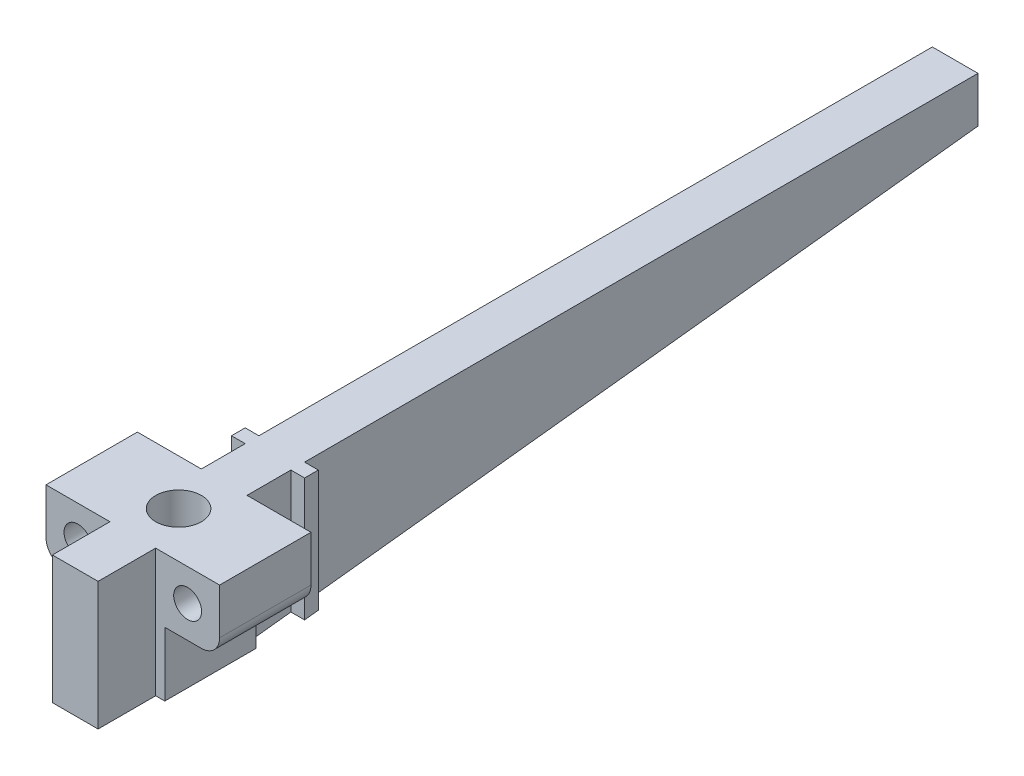
ISO-10303-21;
HEADER;
FILE_DESCRIPTION(('STEP AP214'),'2;1');
FILE_NAME('part.step','',(''),(''),'','','');
FILE_SCHEMA(('AUTOMOTIVE_DESIGN { 1 0 10303 214 1 1 1 1 }'));
ENDSEC;
DATA;
#1=APPLICATION_CONTEXT('core data for automotive mechanical design processes');
#2=APPLICATION_PROTOCOL_DEFINITION('international standard','automotive_design',2000,#1);
#3=PRODUCT_CONTEXT('',#1,'mechanical');
#4=PRODUCT('Part','Part','',(#3));
#5=PRODUCT_RELATED_PRODUCT_CATEGORY('part','',(#4));
#6=PRODUCT_DEFINITION_FORMATION('','',#4);
#7=PRODUCT_DEFINITION_CONTEXT('part definition',#1,'design');
#8=PRODUCT_DEFINITION('design','',#6,#7);
#9=PRODUCT_DEFINITION_SHAPE('','',#8);
#10=(LENGTH_UNIT() NAMED_UNIT(*) SI_UNIT(.MILLI.,.METRE.));
#11=(NAMED_UNIT(*) PLANE_ANGLE_UNIT() SI_UNIT($,.RADIAN.));
#12=(NAMED_UNIT(*) SI_UNIT($,.STERADIAN.) SOLID_ANGLE_UNIT());
#13=UNCERTAINTY_MEASURE_WITH_UNIT(LENGTH_MEASURE(1.E-05),#10,'distance_accuracy_value','');
#14=(GEOMETRIC_REPRESENTATION_CONTEXT(3) GLOBAL_UNCERTAINTY_ASSIGNED_CONTEXT((#13)) GLOBAL_UNIT_ASSIGNED_CONTEXT((#10,
#11,#12)) REPRESENTATION_CONTEXT('',''));
#15=CARTESIAN_POINT('',(0.,0.,0.));
#16=DIRECTION('',(0.,0.,1.));
#17=DIRECTION('',(1.,0.,0.));
#18=AXIS2_PLACEMENT_3D('',#15,#16,#17);
#19=CARTESIAN_POINT('',(2.39047337661692,0.,0.));
#20=DIRECTION('',(1.,0.,0.));
#21=DIRECTION('',(0.,0.,-1.));
#22=AXIS2_PLACEMENT_3D('',#19,#20,#21);
#23=PLANE('',#22);
#24=DIRECTION('',(0.,-1.,0.));
#25=VECTOR('',#24,1.);
#26=CARTESIAN_POINT('',(2.39047337661692,0.,-6.3));
#27=LINE('',#26,#25);
#28=CARTESIAN_POINT('',(2.39047337661692,6.30136094619758,-6.3));
#29=VERTEX_POINT('',#28);
#30=CARTESIAN_POINT('',(2.39047337661692,-6.98988905380242,-6.3));
#31=VERTEX_POINT('',#30);
#32=EDGE_CURVE('E225',#29,#31,#27,.T.);
#33=ORIENTED_EDGE('',*,*,#32,.F.);
#34=DIRECTION('',(0.,0.,1.));
#35=VECTOR('',#34,1.);
#36=CARTESIAN_POINT('',(2.39047337661692,6.30136094619758,0.));
#37=LINE('',#36,#35);
#38=CARTESIAN_POINT('',(2.39047337661692,6.30136094619758,-80.));
#39=VERTEX_POINT('',#38);
#40=EDGE_CURVE('E325',#39,#29,#37,.T.);
#41=ORIENTED_EDGE('',*,*,#40,.F.);
#42=DIRECTION('',(0.,1.,0.));
#43=VECTOR('',#42,1.);
#44=CARTESIAN_POINT('',(2.39047337661692,6.30136094619758,-80.));
#45=LINE('',#44,#43);
#46=CARTESIAN_POINT('',(2.39047337661692,1.30136094619758,-80.));
#47=VERTEX_POINT('',#46);
#48=EDGE_CURVE('E321',#47,#39,#45,.T.);
#49=ORIENTED_EDGE('',*,*,#48,.F.);
#50=DIRECTION('',(0.,0.111794773067865,-0.993731316158802));
#51=VECTOR('',#50,1.);
#52=CARTESIAN_POINT('',(2.39047337661692,1.30136094619758,-80.));
#53=LINE('',#52,#51);
#54=EDGE_CURVE('E318',#31,#47,#53,.T.);
#55=ORIENTED_EDGE('',*,*,#54,.F.);
#56=EDGE_LOOP('',(#33,#41,#49,#55));
#57=FACE_BOUND('',#56,.T.);
#58=ADVANCED_FACE('F36',(#57),#23,.F.);
#59=CARTESIAN_POINT('',(7.39047337661692,0.,0.));
#60=DIRECTION('',(1.,0.,0.));
#61=DIRECTION('',(0.,0.,-1.));
#62=AXIS2_PLACEMENT_3D('',#59,#60,#61);
#63=PLANE('',#62);
#64=DIRECTION('',(0.,0.111794773067865,-0.993731316158802));
#65=VECTOR('',#64,1.);
#66=CARTESIAN_POINT('',(7.39047337661692,1.30136094619758,-80.));
#67=LINE('',#66,#65);
#68=CARTESIAN_POINT('',(7.39047337661692,-7.69863905380242,0.));
#69=VERTEX_POINT('',#68);
#70=CARTESIAN_POINT('',(7.39047337661692,-7.15863905380242,-4.80000000000001));
#71=VERTEX_POINT('',#70);
#72=EDGE_CURVE('E307',#69,#71,#67,.T.);
#73=ORIENTED_EDGE('',*,*,#72,.T.);
#74=DIRECTION('',(0.,-1.,0.));
#75=VECTOR('',#74,1.);
#76=CARTESIAN_POINT('',(7.39047337661692,0.,-4.8));
#77=LINE('',#76,#75);
#78=CARTESIAN_POINT('',(7.39047337661692,6.30136094619758,-4.8));
#79=VERTEX_POINT('',#78);
#80=EDGE_CURVE('E59',#79,#71,#77,.T.);
#81=ORIENTED_EDGE('',*,*,#80,.F.);
#82=DIRECTION('',(0.,0.,1.));
#83=VECTOR('',#82,1.);
#84=CARTESIAN_POINT('',(7.39047337661692,6.30136094619758,0.));
#85=LINE('',#84,#83);
#86=CARTESIAN_POINT('',(7.39047337661692,6.30136094619758,0.));
#87=VERTEX_POINT('',#86);
#88=EDGE_CURVE('E312',#79,#87,#85,.T.);
#89=ORIENTED_EDGE('',*,*,#88,.T.);
#90=DIRECTION('',(0.,-1.,0.));
#91=VECTOR('',#90,1.);
#92=CARTESIAN_POINT('',(7.39047337661692,6.30136094619758,0.));
#93=LINE('',#92,#91);
#94=EDGE_CURVE('E303',#87,#69,#93,.T.);
#95=ORIENTED_EDGE('',*,*,#94,.T.);
#96=EDGE_LOOP('',(#73,#81,#89,#95));
#97=FACE_BOUND('',#96,.T.);
#98=ADVANCED_FACE('F499',(#97),#63,.T.);
#99=CARTESIAN_POINT('',(-2.60952662338309,1.30136094619758,10.));
#100=DIRECTION('',(0.,0.,1.));
#101=DIRECTION('',(1.,0.,0.));
#102=AXIS2_PLACEMENT_3D('',#99,#100,#101);
#103=PLANE('',#102);
#104=DIRECTION('',(0.,-1.,0.));
#105=VECTOR('',#104,1.);
#106=CARTESIAN_POINT('',(2.39047337661692,6.30136094619758,10.));
#107=LINE('',#106,#105);
#108=CARTESIAN_POINT('',(2.39047337661692,6.30136094619758,10.));
#109=VERTEX_POINT('',#108);
#110=CARTESIAN_POINT('',(2.39047337661692,-7.69863905380242,10.));
#111=VERTEX_POINT('',#110);
#112=EDGE_CURVE('E276',#109,#111,#107,.T.);
#113=ORIENTED_EDGE('',*,*,#112,.F.);
#114=DIRECTION('',(-1.,0.,0.));
#115=VECTOR('',#114,1.);
#116=CARTESIAN_POINT('',(14.3904733766169,6.30136094619758,10.));
#117=LINE('',#116,#115);
#118=CARTESIAN_POINT('',(-4.60952662338308,6.30136094619758,10.));
#119=VERTEX_POINT('',#118);
#120=EDGE_CURVE('E351',#109,#119,#117,.T.);
#121=ORIENTED_EDGE('',*,*,#120,.T.);
#122=DIRECTION('',(0.,-1.,0.));
#123=VECTOR('',#122,1.);
#124=CARTESIAN_POINT('',(-4.60952662338308,6.30136094619758,10.));
#125=LINE('',#124,#123);
#126=CARTESIAN_POINT('',(-4.60952662338308,1.30136094619758,10.));
#127=VERTEX_POINT('',#126);
#128=EDGE_CURVE('E350',#119,#127,#125,.T.);
#129=ORIENTED_EDGE('',*,*,#128,.T.);
#130=CARTESIAN_POINT('',(-2.60952662338309,1.30136094619758,10.));
#131=DIRECTION('',(0.,0.,1.));
#132=DIRECTION('',(1.,0.,0.));
#133=AXIS2_PLACEMENT_3D('',#130,#131,#132);
#134=CIRCLE('',#133,2.);
#135=CARTESIAN_POINT('',(-2.60952662338309,-0.698639053802419,10.));
#136=VERTEX_POINT('',#135);
#137=EDGE_CURVE('E353',#127,#136,#134,.T.);
#138=ORIENTED_EDGE('',*,*,#137,.T.);
#139=DIRECTION('',(1.,0.,0.));
#140=VECTOR('',#139,1.);
#141=CARTESIAN_POINT('',(-2.60952662338309,-0.698639053802422,10.));
#142=LINE('',#141,#140);
#143=CARTESIAN_POINT('',(1.39047337661689,-0.698639053802422,10.));
#144=VERTEX_POINT('',#143);
#145=EDGE_CURVE('E355',#136,#144,#142,.T.);
#146=ORIENTED_EDGE('',*,*,#145,.T.);
#147=DIRECTION('',(0.,-1.,0.));
#148=VECTOR('',#147,1.);
#149=CARTESIAN_POINT('',(1.39047337661689,-0.698639053802422,10.));
#150=LINE('',#149,#148);
#151=CARTESIAN_POINT('',(1.39047337661689,-7.69863905380242,10.));
#152=VERTEX_POINT('',#151);
#153=EDGE_CURVE('E357',#144,#152,#150,.T.);
#154=ORIENTED_EDGE('',*,*,#153,.T.);
#155=DIRECTION('',(1.,0.,0.));
#156=VECTOR('',#155,1.);
#157=CARTESIAN_POINT('',(1.39047337661689,-7.69863905380242,10.));
#158=LINE('',#157,#156);
#159=EDGE_CURVE('E360',#152,#111,#158,.T.);
#160=ORIENTED_EDGE('',*,*,#159,.T.);
#161=EDGE_LOOP('',(#113,#121,#129,#138,#146,#154,#160));
#162=FACE_BOUND('',#161,.T.);
#163=CARTESIAN_POINT('',(-1.10952662338309,2.80136094619758,10.));
#164=DIRECTION('',(0.,0.,1.));
#165=DIRECTION('',(1.,0.,0.));
#166=AXIS2_PLACEMENT_3D('',#163,#164,#165);
#167=CIRCLE('',#166,1.52500000000001);
#168=CARTESIAN_POINT('',(0.415473376616922,2.80136094619758,10.));
#169=VERTEX_POINT('',#168);
#170=EDGE_CURVE('E336',#169,#169,#167,.T.);
#171=ORIENTED_EDGE('',*,*,#170,.F.);
#172=EDGE_LOOP('',(#171));
#173=FACE_BOUND('',#172,.T.);
#174=ADVANCED_FACE('F443',(#162,#173),#103,.T.);
#175=CARTESIAN_POINT('',(-2.60952662338309,1.30136094619758,0.));
#176=DIRECTION('',(0.,0.,1.));
#177=DIRECTION('',(1.,0.,0.));
#178=AXIS2_PLACEMENT_3D('',#175,#176,#177);
#179=PLANE('',#178);
#180=CARTESIAN_POINT('',(10.8904733766169,2.80136094619758,0.));
#181=DIRECTION('',(0.,0.,1.));
#182=DIRECTION('',(1.,0.,0.));
#183=AXIS2_PLACEMENT_3D('',#180,#181,#182);
#184=CIRCLE('',#183,1.52500000000001);
#185=CARTESIAN_POINT('',(12.4154733766169,2.80136094619758,0.));
#186=VERTEX_POINT('',#185);
#187=EDGE_CURVE('E339',#186,#186,#184,.T.);
#188=ORIENTED_EDGE('',*,*,#187,.T.);
#189=EDGE_LOOP('',(#188));
#190=FACE_BOUND('',#189,.T.);
#191=ORIENTED_EDGE('',*,*,#94,.F.);
#192=DIRECTION('',(-1.,0.,0.));
#193=VECTOR('',#192,1.);
#194=CARTESIAN_POINT('',(14.3904733766169,6.30136094619758,0.));
#195=LINE('',#194,#193);
#196=CARTESIAN_POINT('',(14.3904733766169,6.30136094619758,0.));
#197=VERTEX_POINT('',#196);
#198=EDGE_CURVE('E371',#197,#87,#195,.T.);
#199=ORIENTED_EDGE('',*,*,#198,.F.);
#200=DIRECTION('',(0.,1.,0.));
#201=VECTOR('',#200,1.);
#202=CARTESIAN_POINT('',(14.3904733766169,1.30136094619758,0.));
#203=LINE('',#202,#201);
#204=CARTESIAN_POINT('',(14.3904733766169,1.30136094619758,0.));
#205=VERTEX_POINT('',#204);
#206=EDGE_CURVE('E392',#205,#197,#203,.T.);
#207=ORIENTED_EDGE('',*,*,#206,.F.);
#208=CARTESIAN_POINT('',(12.3904733766169,1.30136094619758,0.));
#209=DIRECTION('',(0.,0.,1.));
#210=DIRECTION('',(1.,0.,0.));
#211=AXIS2_PLACEMENT_3D('',#208,#209,#210);
#212=CIRCLE('',#211,2.);
#213=CARTESIAN_POINT('',(12.3904733766169,-0.698639053802422,0.));
#214=VERTEX_POINT('',#213);
#215=EDGE_CURVE('E390',#214,#205,#212,.T.);
#216=ORIENTED_EDGE('',*,*,#215,.F.);
#217=DIRECTION('',(1.,0.,0.));
#218=VECTOR('',#217,1.);
#219=CARTESIAN_POINT('',(8.39047337661691,-0.698639053802422,0.));
#220=LINE('',#219,#218);
#221=CARTESIAN_POINT('',(8.39047337661691,-0.698639053802422,0.));
#222=VERTEX_POINT('',#221);
#223=EDGE_CURVE('E388',#222,#214,#220,.T.);
#224=ORIENTED_EDGE('',*,*,#223,.F.);
#225=DIRECTION('',(0.,1.,0.));
#226=VECTOR('',#225,1.);
#227=CARTESIAN_POINT('',(8.39047337661691,-7.69863905380242,0.));
#228=LINE('',#227,#226);
#229=CARTESIAN_POINT('',(8.39047337661691,-7.69863905380242,0.));
#230=VERTEX_POINT('',#229);
#231=EDGE_CURVE('E386',#230,#222,#228,.T.);
#232=ORIENTED_EDGE('',*,*,#231,.F.);
#233=DIRECTION('',(1.,0.,0.));
#234=VECTOR('',#233,1.);
#235=CARTESIAN_POINT('',(1.39047337661689,-7.69863905380242,0.));
#236=LINE('',#235,#234);
#237=EDGE_CURVE('E382',#69,#230,#236,.T.);
#238=ORIENTED_EDGE('',*,*,#237,.F.);
#239=EDGE_LOOP('',(#191,#199,#207,#216,#224,#232,#238));
#240=FACE_BOUND('',#239,.T.);
#241=ADVANCED_FACE('F498',(#190,#240),#179,.F.);
#242=DIRECTION('',(0.,1.,0.));
#243=VECTOR('',#242,1.);
#244=CARTESIAN_POINT('',(7.39047337661692,6.30136094619758,10.));
#245=LINE('',#244,#243);
#246=CARTESIAN_POINT('',(7.39047337661692,-7.69863905380242,10.));
#247=VERTEX_POINT('',#246);
#248=CARTESIAN_POINT('',(7.39047337661692,6.30136094619758,10.));
#249=VERTEX_POINT('',#248);
#250=EDGE_CURVE('E281',#247,#249,#245,.T.);
#251=ORIENTED_EDGE('',*,*,#250,.F.);
#252=CARTESIAN_POINT('',(8.39047337661691,-7.69863905380242,10.));
#253=VERTEX_POINT('',#252);
#254=EDGE_CURVE('E359',#247,#253,#158,.T.);
#255=ORIENTED_EDGE('',*,*,#254,.T.);
#256=DIRECTION('',(0.,1.,0.));
#257=VECTOR('',#256,1.);
#258=CARTESIAN_POINT('',(8.39047337661691,-7.69863905380242,10.));
#259=LINE('',#258,#257);
#260=CARTESIAN_POINT('',(8.39047337661691,-0.698639053802422,10.));
#261=VERTEX_POINT('',#260);
#262=EDGE_CURVE('E362',#253,#261,#259,.T.);
#263=ORIENTED_EDGE('',*,*,#262,.T.);
#264=DIRECTION('',(1.,0.,0.));
#265=VECTOR('',#264,1.);
#266=CARTESIAN_POINT('',(8.39047337661691,-0.698639053802422,10.));
#267=LINE('',#266,#265);
#268=CARTESIAN_POINT('',(12.3904733766169,-0.698639053802422,10.));
#269=VERTEX_POINT('',#268);
#270=EDGE_CURVE('E364',#261,#269,#267,.T.);
#271=ORIENTED_EDGE('',*,*,#270,.T.);
#272=CARTESIAN_POINT('',(12.3904733766169,1.30136094619758,10.));
#273=DIRECTION('',(0.,0.,1.));
#274=DIRECTION('',(1.,0.,0.));
#275=AXIS2_PLACEMENT_3D('',#272,#273,#274);
#276=CIRCLE('',#275,2.);
#277=CARTESIAN_POINT('',(14.3904733766169,1.30136094619758,10.));
#278=VERTEX_POINT('',#277);
#279=EDGE_CURVE('E366',#269,#278,#276,.T.);
#280=ORIENTED_EDGE('',*,*,#279,.T.);
#281=DIRECTION('',(0.,1.,0.));
#282=VECTOR('',#281,1.);
#283=CARTESIAN_POINT('',(14.3904733766169,1.30136094619758,10.));
#284=LINE('',#283,#282);
#285=CARTESIAN_POINT('',(14.3904733766169,6.30136094619758,10.));
#286=VERTEX_POINT('',#285);
#287=EDGE_CURVE('E368',#278,#286,#284,.T.);
#288=ORIENTED_EDGE('',*,*,#287,.T.);
#289=EDGE_CURVE('E348',#286,#249,#117,.T.);
#290=ORIENTED_EDGE('',*,*,#289,.T.);
#291=EDGE_LOOP('',(#251,#255,#263,#271,#280,#288,#290));
#292=FACE_BOUND('',#291,.T.);
#293=CARTESIAN_POINT('',(10.8904733766169,2.80136094619758,10.));
#294=DIRECTION('',(0.,0.,1.));
#295=DIRECTION('',(1.,0.,0.));
#296=AXIS2_PLACEMENT_3D('',#293,#294,#295);
#297=CIRCLE('',#296,1.52500000000001);
#298=CARTESIAN_POINT('',(12.4154733766169,2.80136094619758,10.));
#299=VERTEX_POINT('',#298);
#300=EDGE_CURVE('E342',#299,#299,#297,.T.);
#301=ORIENTED_EDGE('',*,*,#300,.F.);
#302=EDGE_LOOP('',(#301));
#303=FACE_BOUND('',#302,.T.);
#304=ADVANCED_FACE('F471',(#292,#303),#103,.T.);
#305=CARTESIAN_POINT('',(2.39047337661692,6.30136094619758,0.));
#306=VERTEX_POINT('',#305);
#307=CARTESIAN_POINT('',(-4.60952662338308,6.30136094619758,0.));
#308=VERTEX_POINT('',#307);
#309=EDGE_CURVE('E345',#306,#308,#195,.T.);
#310=ORIENTED_EDGE('',*,*,#309,.F.);
#311=DIRECTION('',(0.,-1.,0.));
#312=VECTOR('',#311,1.);
#313=CARTESIAN_POINT('',(2.39047337661692,6.30136094619758,0.));
#314=LINE('',#313,#312);
#315=CARTESIAN_POINT('',(2.39047337661692,-7.69863905380242,0.));
#316=VERTEX_POINT('',#315);
#317=EDGE_CURVE('E315',#306,#316,#314,.T.);
#318=ORIENTED_EDGE('',*,*,#317,.T.);
#319=CARTESIAN_POINT('',(1.39047337661689,-7.69863905380242,0.));
#320=VERTEX_POINT('',#319);
#321=EDGE_CURVE('E383',#320,#316,#236,.T.);
#322=ORIENTED_EDGE('',*,*,#321,.F.);
#323=DIRECTION('',(0.,-1.,0.));
#324=VECTOR('',#323,1.);
#325=CARTESIAN_POINT('',(1.39047337661689,-0.698639053802422,0.));
#326=LINE('',#325,#324);
#327=CARTESIAN_POINT('',(1.39047337661689,-0.698639053802422,0.));
#328=VERTEX_POINT('',#327);
#329=EDGE_CURVE('E380',#328,#320,#326,.T.);
#330=ORIENTED_EDGE('',*,*,#329,.F.);
#331=DIRECTION('',(1.,0.,0.));
#332=VECTOR('',#331,1.);
#333=CARTESIAN_POINT('',(-2.60952662338309,-0.698639053802422,0.));
#334=LINE('',#333,#332);
#335=CARTESIAN_POINT('',(-2.60952662338309,-0.698639053802419,0.));
#336=VERTEX_POINT('',#335);
#337=EDGE_CURVE('E378',#336,#328,#334,.T.);
#338=ORIENTED_EDGE('',*,*,#337,.F.);
#339=CARTESIAN_POINT('',(-2.60952662338309,1.30136094619758,0.));
#340=DIRECTION('',(0.,0.,1.));
#341=DIRECTION('',(1.,0.,0.));
#342=AXIS2_PLACEMENT_3D('',#339,#340,#341);
#343=CIRCLE('',#342,2.);
#344=CARTESIAN_POINT('',(-4.60952662338308,1.30136094619758,0.));
#345=VERTEX_POINT('',#344);
#346=EDGE_CURVE('E376',#345,#336,#343,.T.);
#347=ORIENTED_EDGE('',*,*,#346,.F.);
#348=DIRECTION('',(0.,-1.,0.));
#349=VECTOR('',#348,1.);
#350=CARTESIAN_POINT('',(-4.60952662338308,6.30136094619758,0.));
#351=LINE('',#350,#349);
#352=EDGE_CURVE('E374',#308,#345,#351,.T.);
#353=ORIENTED_EDGE('',*,*,#352,.F.);
#354=EDGE_LOOP('',(#310,#318,#322,#330,#338,#347,#353));
#355=FACE_BOUND('',#354,.T.);
#356=CARTESIAN_POINT('',(-1.10952662338309,2.80136094619758,0.));
#357=DIRECTION('',(0.,0.,1.));
#358=DIRECTION('',(1.,0.,0.));
#359=AXIS2_PLACEMENT_3D('',#356,#357,#358);
#360=CIRCLE('',#359,1.52500000000001);
#361=CARTESIAN_POINT('',(0.415473376616922,2.80136094619758,0.));
#362=VERTEX_POINT('',#361);
#363=EDGE_CURVE('E331',#362,#362,#360,.T.);
#364=ORIENTED_EDGE('',*,*,#363,.T.);
#365=EDGE_LOOP('',(#364));
#366=FACE_BOUND('',#365,.T.);
#367=ADVANCED_FACE('F429',(#355,#366),#179,.F.);
#368=CARTESIAN_POINT('',(14.3904733766169,6.30136094619758,10.));
#369=DIRECTION('',(0.,-1.,0.));
#370=DIRECTION('',(0.,0.,-1.));
#371=AXIS2_PLACEMENT_3D('',#368,#369,#370);
#372=PLANE('',#371);
#373=CARTESIAN_POINT('',(4.90088276251299,6.30136094619758,5.));
#374=DIRECTION('',(0.,1.,0.));
#375=DIRECTION('',(0.,0.,1.));
#376=AXIS2_PLACEMENT_3D('',#373,#374,#375);
#377=CIRCLE('',#376,2.5);
#378=CARTESIAN_POINT('',(4.90088276251299,6.30136094619758,7.5));
#379=VERTEX_POINT('',#378);
#380=EDGE_CURVE('E270',#379,#379,#377,.T.);
#381=ORIENTED_EDGE('',*,*,#380,.F.);
#382=EDGE_LOOP('',(#381));
#383=FACE_BOUND('',#382,.T.);
#384=ORIENTED_EDGE('',*,*,#198,.T.);
#385=ORIENTED_EDGE('',*,*,#88,.F.);
#386=DIRECTION('',(-1.,0.,0.));
#387=VECTOR('',#386,1.);
#388=CARTESIAN_POINT('',(8.89047337661692,6.30136094619758,-4.8));
#389=LINE('',#388,#387);
#390=CARTESIAN_POINT('',(8.89047337661692,6.30136094619758,-4.8));
#391=VERTEX_POINT('',#390);
#392=EDGE_CURVE('E264',#391,#79,#389,.T.);
#393=ORIENTED_EDGE('',*,*,#392,.F.);
#394=DIRECTION('',(0.,0.,1.));
#395=VECTOR('',#394,1.);
#396=CARTESIAN_POINT('',(8.89047337661692,6.30136094619758,0.));
#397=LINE('',#396,#395);
#398=CARTESIAN_POINT('',(8.89047337661692,6.30136094619758,-6.3));
#399=VERTEX_POINT('',#398);
#400=EDGE_CURVE('E249',#399,#391,#397,.T.);
#401=ORIENTED_EDGE('',*,*,#400,.F.);
#402=DIRECTION('',(-1.,0.,0.));
#403=VECTOR('',#402,1.);
#404=CARTESIAN_POINT('',(8.89047337661692,6.30136094619758,-6.3));
#405=LINE('',#404,#403);
#406=CARTESIAN_POINT('',(7.39047337661692,6.30136094619758,-6.3));
#407=VERTEX_POINT('',#406);
#408=EDGE_CURVE('E267',#399,#407,#405,.T.);
#409=ORIENTED_EDGE('',*,*,#408,.T.);
#410=CARTESIAN_POINT('',(7.39047337661692,6.30136094619758,-80.));
#411=VERTEX_POINT('',#410);
#412=EDGE_CURVE('E313',#411,#407,#85,.T.);
#413=ORIENTED_EDGE('',*,*,#412,.F.);
#414=DIRECTION('',(1.,0.,0.));
#415=VECTOR('',#414,1.);
#416=CARTESIAN_POINT('',(2.39047337661692,6.30136094619758,-80.));
#417=LINE('',#416,#415);
#418=EDGE_CURVE('E329',#39,#411,#417,.T.);
#419=ORIENTED_EDGE('',*,*,#418,.F.);
#420=ORIENTED_EDGE('',*,*,#40,.T.);
#421=DIRECTION('',(1.,0.,0.));
#422=VECTOR('',#421,1.);
#423=CARTESIAN_POINT('',(0.890473376616917,6.30136094619758,-6.3));
#424=LINE('',#423,#422);
#425=CARTESIAN_POINT('',(0.890473376616917,6.30136094619758,-6.3));
#426=VERTEX_POINT('',#425);
#427=EDGE_CURVE('E239',#426,#29,#424,.T.);
#428=ORIENTED_EDGE('',*,*,#427,.F.);
#429=DIRECTION('',(0.,0.,1.));
#430=VECTOR('',#429,1.);
#431=CARTESIAN_POINT('',(0.890473376616917,6.30136094619758,0.));
#432=LINE('',#431,#430);
#433=CARTESIAN_POINT('',(0.890473376616917,6.30136094619758,-4.8));
#434=VERTEX_POINT('',#433);
#435=EDGE_CURVE('E218',#426,#434,#432,.T.);
#436=ORIENTED_EDGE('',*,*,#435,.T.);
#437=DIRECTION('',(1.,0.,0.));
#438=VECTOR('',#437,1.);
#439=CARTESIAN_POINT('',(0.890473376616917,6.30136094619758,-4.8));
#440=LINE('',#439,#438);
#441=CARTESIAN_POINT('',(2.39047337661692,6.30136094619758,-4.8));
#442=VERTEX_POINT('',#441);
#443=EDGE_CURVE('E243',#434,#442,#440,.T.);
#444=ORIENTED_EDGE('',*,*,#443,.T.);
#445=EDGE_CURVE('E324',#442,#306,#37,.T.);
#446=ORIENTED_EDGE('',*,*,#445,.T.);
#447=ORIENTED_EDGE('',*,*,#309,.T.);
#448=DIRECTION('',(0.,0.,-1.));
#449=VECTOR('',#448,1.);
#450=CARTESIAN_POINT('',(-4.60952662338308,6.30136094619758,10.));
#451=LINE('',#450,#449);
#452=EDGE_CURVE('E11',#119,#308,#451,.T.);
#453=ORIENTED_EDGE('',*,*,#452,.F.);
#454=ORIENTED_EDGE('',*,*,#120,.F.);
#455=DIRECTION('',(0.,0.,-1.));
#456=VECTOR('',#455,1.);
#457=CARTESIAN_POINT('',(2.39047337661692,6.30136094619758,16.3));
#458=LINE('',#457,#456);
#459=CARTESIAN_POINT('',(2.39047337661692,6.30136094619758,16.3));
#460=VERTEX_POINT('',#459);
#461=EDGE_CURVE('E287',#460,#109,#458,.T.);
#462=ORIENTED_EDGE('',*,*,#461,.F.);
#463=DIRECTION('',(-1.,0.,0.));
#464=VECTOR('',#463,1.);
#465=CARTESIAN_POINT('',(2.39047337661692,6.30136094619758,16.3));
#466=LINE('',#465,#464);
#467=CARTESIAN_POINT('',(7.39047337661692,6.30136094619758,16.3));
#468=VERTEX_POINT('',#467);
#469=EDGE_CURVE('E285',#468,#460,#466,.T.);
#470=ORIENTED_EDGE('',*,*,#469,.F.);
#471=DIRECTION('',(0.,0.,-1.));
#472=VECTOR('',#471,1.);
#473=CARTESIAN_POINT('',(7.39047337661692,6.30136094619758,16.3));
#474=LINE('',#473,#472);
#475=EDGE_CURVE('E294',#468,#249,#474,.T.);
#476=ORIENTED_EDGE('',*,*,#475,.T.);
#477=ORIENTED_EDGE('',*,*,#289,.F.);
#478=DIRECTION('',(0.,0.,-1.));
#479=VECTOR('',#478,1.);
#480=CARTESIAN_POINT('',(14.3904733766169,6.30136094619758,10.));
#481=LINE('',#480,#479);
#482=EDGE_CURVE('E370',#286,#197,#481,.T.);
#483=ORIENTED_EDGE('',*,*,#482,.T.);
#484=EDGE_LOOP('',(#384,#385,#393,#401,#409,#413,#419,#420,#428,#436,#444,#446,#447,#453,#454,
#462,#470,#476,#477,#483));
#485=FACE_BOUND('',#484,.T.);
#486=ADVANCED_FACE('F38',(#383,#485),#372,.F.);
#487=CARTESIAN_POINT('',(-4.60952662338308,6.30136094619758,10.));
#488=DIRECTION('',(1.,0.,0.));
#489=DIRECTION('',(0.,0.,-1.));
#490=AXIS2_PLACEMENT_3D('',#487,#488,#489);
#491=PLANE('',#490);
#492=ORIENTED_EDGE('',*,*,#352,.T.);
#493=DIRECTION('',(0.,0.,-1.));
#494=VECTOR('',#493,1.);
#495=CARTESIAN_POINT('',(-4.60952662338308,1.30136094619758,10.));
#496=LINE('',#495,#494);
#497=EDGE_CURVE('E44',#127,#345,#496,.T.);
#498=ORIENTED_EDGE('',*,*,#497,.F.);
#499=ORIENTED_EDGE('',*,*,#128,.F.);
#500=ORIENTED_EDGE('',*,*,#452,.T.);
#501=EDGE_LOOP('',(#492,#498,#499,#500));
#502=FACE_BOUND('',#501,.T.);
#503=ADVANCED_FACE('F447',(#502),#491,.F.);
#504=CARTESIAN_POINT('',(-2.60952662338309,1.30136094619758,10.));
#505=DIRECTION('',(0.,0.,-1.));
#506=DIRECTION('',(-1.,0.,0.));
#507=AXIS2_PLACEMENT_3D('',#504,#505,#506);
#508=CYLINDRICAL_SURFACE('',#507,2.);
#509=ORIENTED_EDGE('',*,*,#346,.T.);
#510=DIRECTION('',(0.,0.,-1.));
#511=VECTOR('',#510,1.);
#512=CARTESIAN_POINT('',(-2.60952662338309,-0.698639053802419,10.));
#513=LINE('',#512,#511);
#514=EDGE_CURVE('E414',#136,#336,#513,.T.);
#515=ORIENTED_EDGE('',*,*,#514,.F.);
#516=ORIENTED_EDGE('',*,*,#137,.F.);
#517=ORIENTED_EDGE('',*,*,#497,.T.);
#518=EDGE_LOOP('',(#509,#515,#516,#517));
#519=FACE_BOUND('',#518,.T.);
#520=ADVANCED_FACE('F421',(#519),#508,.T.);
#521=CARTESIAN_POINT('',(-2.60952662338309,-0.698639053802422,10.));
#522=DIRECTION('',(0.,1.,0.));
#523=DIRECTION('',(0.,0.,1.));
#524=AXIS2_PLACEMENT_3D('',#521,#522,#523);
#525=PLANE('',#524);
#526=ORIENTED_EDGE('',*,*,#337,.T.);
#527=DIRECTION('',(0.,0.,-1.));
#528=VECTOR('',#527,1.);
#529=CARTESIAN_POINT('',(1.39047337661689,-0.698639053802422,10.));
#530=LINE('',#529,#528);
#531=EDGE_CURVE('E411',#144,#328,#530,.T.);
#532=ORIENTED_EDGE('',*,*,#531,.F.);
#533=ORIENTED_EDGE('',*,*,#145,.F.);
#534=ORIENTED_EDGE('',*,*,#514,.T.);
#535=EDGE_LOOP('',(#526,#532,#533,#534));
#536=FACE_BOUND('',#535,.T.);
#537=ADVANCED_FACE('F435',(#536),#525,.F.);
#538=CARTESIAN_POINT('',(1.39047337661689,-0.698639053802422,10.));
#539=DIRECTION('',(1.,0.,0.));
#540=DIRECTION('',(0.,0.,-1.));
#541=AXIS2_PLACEMENT_3D('',#538,#539,#540);
#542=PLANE('',#541);
#543=ORIENTED_EDGE('',*,*,#329,.T.);
#544=DIRECTION('',(0.,0.,-1.));
#545=VECTOR('',#544,1.);
#546=CARTESIAN_POINT('',(1.39047337661689,-7.69863905380242,10.));
#547=LINE('',#546,#545);
#548=EDGE_CURVE('E408',#152,#320,#547,.T.);
#549=ORIENTED_EDGE('',*,*,#548,.F.);
#550=ORIENTED_EDGE('',*,*,#153,.F.);
#551=ORIENTED_EDGE('',*,*,#531,.T.);
#552=EDGE_LOOP('',(#543,#549,#550,#551));
#553=FACE_BOUND('',#552,.T.);
#554=ADVANCED_FACE('F439',(#553),#542,.F.);
#555=CARTESIAN_POINT('',(1.39047337661689,-7.69863905380242,10.));
#556=DIRECTION('',(0.,1.,0.));
#557=DIRECTION('',(0.,0.,1.));
#558=AXIS2_PLACEMENT_3D('',#555,#556,#557);
#559=PLANE('',#558);
#560=CARTESIAN_POINT('',(4.90088276251299,-7.69863905380242,5.));
#561=DIRECTION('',(0.,1.,0.));
#562=DIRECTION('',(0.,0.,1.));
#563=AXIS2_PLACEMENT_3D('',#560,#561,#562);
#564=CIRCLE('',#563,2.5);
#565=CARTESIAN_POINT('',(4.90088276251299,-7.69863905380242,7.5));
#566=VERTEX_POINT('',#565);
#567=EDGE_CURVE('E273',#566,#566,#564,.F.);
#568=ORIENTED_EDGE('',*,*,#567,.F.);
#569=EDGE_LOOP('',(#568));
#570=FACE_BOUND('',#569,.T.);
#571=ORIENTED_EDGE('',*,*,#321,.T.);
#572=DIRECTION('',(1.,0.,0.));
#573=VECTOR('',#572,1.);
#574=CARTESIAN_POINT('',(2.39047337661692,-7.69863905380242,0.));
#575=LINE('',#574,#573);
#576=EDGE_CURVE('E328',#316,#69,#575,.T.);
#577=ORIENTED_EDGE('',*,*,#576,.T.);
#578=ORIENTED_EDGE('',*,*,#237,.T.);
#579=DIRECTION('',(0.,0.,-1.));
#580=VECTOR('',#579,1.);
#581=CARTESIAN_POINT('',(8.39047337661691,-7.69863905380242,10.));
#582=LINE('',#581,#580);
#583=EDGE_CURVE('E405',#253,#230,#582,.T.);
#584=ORIENTED_EDGE('',*,*,#583,.F.);
#585=ORIENTED_EDGE('',*,*,#254,.F.);
#586=DIRECTION('',(0.,0.,-1.));
#587=VECTOR('',#586,1.);
#588=CARTESIAN_POINT('',(7.39047337661692,-7.69863905380242,16.3));
#589=LINE('',#588,#587);
#590=CARTESIAN_POINT('',(7.39047337661692,-7.69863905380242,16.3));
#591=VERTEX_POINT('',#590);
#592=EDGE_CURVE('E297',#591,#247,#589,.T.);
#593=ORIENTED_EDGE('',*,*,#592,.F.);
#594=DIRECTION('',(1.,0.,0.));
#595=VECTOR('',#594,1.);
#596=CARTESIAN_POINT('',(2.39047337661692,-7.69863905380242,16.3));
#597=LINE('',#596,#595);
#598=CARTESIAN_POINT('',(2.39047337661692,-7.69863905380242,16.3));
#599=VERTEX_POINT('',#598);
#600=EDGE_CURVE('E280',#599,#591,#597,.T.);
#601=ORIENTED_EDGE('',*,*,#600,.F.);
#602=DIRECTION('',(0.,0.,-1.));
#603=VECTOR('',#602,1.);
#604=CARTESIAN_POINT('',(2.39047337661692,-7.69863905380242,16.3));
#605=LINE('',#604,#603);
#606=EDGE_CURVE('E300',#599,#111,#605,.T.);
#607=ORIENTED_EDGE('',*,*,#606,.T.);
#608=ORIENTED_EDGE('',*,*,#159,.F.);
#609=ORIENTED_EDGE('',*,*,#548,.T.);
#610=EDGE_LOOP('',(#571,#577,#578,#584,#585,#593,#601,#607,#608,#609));
#611=FACE_BOUND('',#610,.T.);
#612=ADVANCED_FACE('F454',(#570,#611),#559,.F.);
#613=CARTESIAN_POINT('',(8.39047337661691,-7.69863905380242,10.));
#614=DIRECTION('',(-1.,0.,0.));
#615=DIRECTION('',(0.,0.,1.));
#616=AXIS2_PLACEMENT_3D('',#613,#614,#615);
#617=PLANE('',#616);
#618=ORIENTED_EDGE('',*,*,#231,.T.);
#619=DIRECTION('',(0.,0.,-1.));
#620=VECTOR('',#619,1.);
#621=CARTESIAN_POINT('',(8.39047337661691,-0.698639053802422,10.));
#622=LINE('',#621,#620);
#623=EDGE_CURVE('E402',#261,#222,#622,.T.);
#624=ORIENTED_EDGE('',*,*,#623,.F.);
#625=ORIENTED_EDGE('',*,*,#262,.F.);
#626=ORIENTED_EDGE('',*,*,#583,.T.);
#627=EDGE_LOOP('',(#618,#624,#625,#626));
#628=FACE_BOUND('',#627,.T.);
#629=ADVANCED_FACE('F479',(#628),#617,.F.);
#630=CARTESIAN_POINT('',(8.39047337661691,-0.698639053802422,10.));
#631=DIRECTION('',(0.,1.,0.));
#632=DIRECTION('',(0.,0.,1.));
#633=AXIS2_PLACEMENT_3D('',#630,#631,#632);
#634=PLANE('',#633);
#635=ORIENTED_EDGE('',*,*,#223,.T.);
#636=DIRECTION('',(0.,0.,-1.));
#637=VECTOR('',#636,1.);
#638=CARTESIAN_POINT('',(12.3904733766169,-0.698639053802422,10.));
#639=LINE('',#638,#637);
#640=EDGE_CURVE('E399',#269,#214,#639,.T.);
#641=ORIENTED_EDGE('',*,*,#640,.F.);
#642=ORIENTED_EDGE('',*,*,#270,.F.);
#643=ORIENTED_EDGE('',*,*,#623,.T.);
#644=EDGE_LOOP('',(#635,#641,#642,#643));
#645=FACE_BOUND('',#644,.T.);
#646=ADVANCED_FACE('F485',(#645),#634,.F.);
#647=CARTESIAN_POINT('',(12.3904733766169,1.30136094619758,10.));
#648=DIRECTION('',(0.,0.,-1.));
#649=DIRECTION('',(-1.,0.,0.));
#650=AXIS2_PLACEMENT_3D('',#647,#648,#649);
#651=CYLINDRICAL_SURFACE('',#650,2.);
#652=ORIENTED_EDGE('',*,*,#215,.T.);
#653=DIRECTION('',(0.,0.,-1.));
#654=VECTOR('',#653,1.);
#655=CARTESIAN_POINT('',(14.3904733766169,1.30136094619758,10.));
#656=LINE('',#655,#654);
#657=EDGE_CURVE('E396',#278,#205,#656,.T.);
#658=ORIENTED_EDGE('',*,*,#657,.F.);
#659=ORIENTED_EDGE('',*,*,#279,.F.);
#660=ORIENTED_EDGE('',*,*,#640,.T.);
#661=EDGE_LOOP('',(#652,#658,#659,#660));
#662=FACE_BOUND('',#661,.T.);
#663=ADVANCED_FACE('F489',(#662),#651,.T.);
#664=CARTESIAN_POINT('',(14.3904733766169,1.30136094619758,10.));
#665=DIRECTION('',(-1.,0.,0.));
#666=DIRECTION('',(0.,0.,1.));
#667=AXIS2_PLACEMENT_3D('',#664,#665,#666);
#668=PLANE('',#667);
#669=ORIENTED_EDGE('',*,*,#206,.T.);
#670=ORIENTED_EDGE('',*,*,#482,.F.);
#671=ORIENTED_EDGE('',*,*,#287,.F.);
#672=ORIENTED_EDGE('',*,*,#657,.T.);
#673=EDGE_LOOP('',(#669,#670,#671,#672));
#674=FACE_BOUND('',#673,.T.);
#675=ADVANCED_FACE('F494',(#674),#668,.F.);
#676=CARTESIAN_POINT('',(10.8904733766169,2.80136094619758,10.));
#677=DIRECTION('',(0.,0.,-1.));
#678=DIRECTION('',(-1.,0.,0.));
#679=AXIS2_PLACEMENT_3D('',#676,#677,#678);
#680=CYLINDRICAL_SURFACE('',#679,1.52500000000001);
#681=ORIENTED_EDGE('',*,*,#300,.T.);
#682=EDGE_LOOP('',(#681));
#683=FACE_BOUND('',#682,.T.);
#684=ORIENTED_EDGE('',*,*,#187,.F.);
#685=EDGE_LOOP('',(#684));
#686=FACE_BOUND('',#685,.T.);
#687=ADVANCED_FACE('F688',(#683,#686),#680,.F.);
#688=CARTESIAN_POINT('',(-1.10952662338309,2.80136094619758,10.));
#689=DIRECTION('',(0.,0.,-1.));
#690=DIRECTION('',(-1.,0.,0.));
#691=AXIS2_PLACEMENT_3D('',#688,#689,#690);
#692=CYLINDRICAL_SURFACE('',#691,1.52500000000001);
#693=ORIENTED_EDGE('',*,*,#170,.T.);
#694=EDGE_LOOP('',(#693));
#695=FACE_BOUND('',#694,.T.);
#696=ORIENTED_EDGE('',*,*,#363,.F.);
#697=EDGE_LOOP('',(#696));
#698=FACE_BOUND('',#697,.T.);
#699=ADVANCED_FACE('F681',(#695,#698),#692,.F.);
#700=CARTESIAN_POINT('',(2.39047337661692,6.30136094619758,-80.));
#701=DIRECTION('',(0.,0.,-1.));
#702=DIRECTION('',(-1.,0.,0.));
#703=AXIS2_PLACEMENT_3D('',#700,#701,#702);
#704=PLANE('',#703);
#705=ORIENTED_EDGE('',*,*,#418,.T.);
#706=DIRECTION('',(0.,1.,0.));
#707=VECTOR('',#706,1.);
#708=CARTESIAN_POINT('',(7.39047337661692,6.30136094619758,-80.));
#709=LINE('',#708,#707);
#710=CARTESIAN_POINT('',(7.39047337661692,1.30136094619758,-80.));
#711=VERTEX_POINT('',#710);
#712=EDGE_CURVE('E309',#711,#411,#709,.T.);
#713=ORIENTED_EDGE('',*,*,#712,.F.);
#714=DIRECTION('',(1.,0.,0.));
#715=VECTOR('',#714,1.);
#716=CARTESIAN_POINT('',(2.39047337661692,1.30136094619758,-80.));
#717=LINE('',#716,#715);
#718=EDGE_CURVE('E332',#47,#711,#717,.T.);
#719=ORIENTED_EDGE('',*,*,#718,.F.);
#720=ORIENTED_EDGE('',*,*,#48,.T.);
#721=EDGE_LOOP('',(#705,#713,#719,#720));
#722=FACE_BOUND('',#721,.T.);
#723=ADVANCED_FACE('F520',(#722),#704,.T.);
#724=CARTESIAN_POINT('',(2.39047337661692,1.30136094619758,-80.));
#725=DIRECTION('',(0.,-0.993731316158802,-0.111794773067865));
#726=DIRECTION('',(0.,0.111794773067865,-0.993731316158802));
#727=AXIS2_PLACEMENT_3D('',#724,#725,#726);
#728=PLANE('',#727);
#729=ORIENTED_EDGE('',*,*,#718,.T.);
#730=CARTESIAN_POINT('',(7.39047337661692,-6.98988905380242,-6.3));
#731=VERTEX_POINT('',#730);
#732=EDGE_CURVE('E306',#731,#711,#67,.T.);
#733=ORIENTED_EDGE('',*,*,#732,.F.);
#734=DIRECTION('',(-1.,0.,0.));
#735=VECTOR('',#734,1.);
#736=CARTESIAN_POINT('',(8.89047337661692,-6.98988905380242,-6.3));
#737=LINE('',#736,#735);
#738=CARTESIAN_POINT('',(8.89047337661692,-6.98988905380242,-6.3));
#739=VERTEX_POINT('',#738);
#740=EDGE_CURVE('E255',#739,#731,#737,.T.);
#741=ORIENTED_EDGE('',*,*,#740,.F.);
#742=DIRECTION('',(0.,0.111794773067865,-0.993731316158802));
#743=VECTOR('',#742,1.);
#744=CARTESIAN_POINT('',(8.89047337661692,-7.60242091410824,-0.855272352837176));
#745=LINE('',#744,#743);
#746=CARTESIAN_POINT('',(8.89047337661692,-7.15863905380242,-4.8));
#747=VERTEX_POINT('',#746);
#748=EDGE_CURVE('E253',#747,#739,#745,.T.);
#749=ORIENTED_EDGE('',*,*,#748,.F.);
#750=DIRECTION('',(-1.,0.,0.));
#751=VECTOR('',#750,1.);
#752=CARTESIAN_POINT('',(8.89047337661692,-7.15863905380242,-4.8));
#753=LINE('',#752,#751);
#754=EDGE_CURVE('E261',#747,#71,#753,.T.);
#755=ORIENTED_EDGE('',*,*,#754,.T.);
#756=ORIENTED_EDGE('',*,*,#72,.F.);
#757=ORIENTED_EDGE('',*,*,#576,.F.);
#758=CARTESIAN_POINT('',(2.39047337661692,-7.15863905380242,-4.8));
#759=VERTEX_POINT('',#758);
#760=EDGE_CURVE('E319',#316,#759,#53,.T.);
#761=ORIENTED_EDGE('',*,*,#760,.T.);
#762=DIRECTION('',(1.,0.,0.));
#763=VECTOR('',#762,1.);
#764=CARTESIAN_POINT('',(0.890473376616917,-7.15863905380242,-4.8));
#765=LINE('',#764,#763);
#766=CARTESIAN_POINT('',(0.890473376616917,-7.15863905380242,-4.8));
#767=VERTEX_POINT('',#766);
#768=EDGE_CURVE('E229',#767,#759,#765,.T.);
#769=ORIENTED_EDGE('',*,*,#768,.F.);
#770=DIRECTION('',(0.,0.111794773067865,-0.993731316158802));
#771=VECTOR('',#770,1.);
#772=CARTESIAN_POINT('',(0.890473376616917,-7.60242091410824,-0.855272352837176));
#773=LINE('',#772,#771);
#774=CARTESIAN_POINT('',(0.890473376616917,-6.98988905380242,-6.3));
#775=VERTEX_POINT('',#774);
#776=EDGE_CURVE('E215',#767,#775,#773,.T.);
#777=ORIENTED_EDGE('',*,*,#776,.T.);
#778=DIRECTION('',(1.,0.,0.));
#779=VECTOR('',#778,1.);
#780=CARTESIAN_POINT('',(0.890473376616917,-6.98988905380242,-6.3));
#781=LINE('',#780,#779);
#782=EDGE_CURVE('E222',#775,#31,#781,.T.);
#783=ORIENTED_EDGE('',*,*,#782,.T.);
#784=ORIENTED_EDGE('',*,*,#54,.T.);
#785=EDGE_LOOP('',(#729,#733,#741,#749,#755,#756,#757,#761,#769,#777,#783,#784));
#786=FACE_BOUND('',#785,.T.);
#787=ADVANCED_FACE('F232',(#786),#728,.T.);
#788=ORIENTED_EDGE('',*,*,#445,.F.);
#789=DIRECTION('',(0.,-1.,0.));
#790=VECTOR('',#789,1.);
#791=CARTESIAN_POINT('',(2.39047337661692,0.,-4.8));
#792=LINE('',#791,#790);
#793=EDGE_CURVE('E51',#442,#759,#792,.T.);
#794=ORIENTED_EDGE('',*,*,#793,.T.);
#795=ORIENTED_EDGE('',*,*,#760,.F.);
#796=ORIENTED_EDGE('',*,*,#317,.F.);
#797=EDGE_LOOP('',(#788,#794,#795,#796));
#798=FACE_BOUND('',#797,.T.);
#799=ADVANCED_FACE('F524',(#798),#23,.F.);
#800=DIRECTION('',(0.,-1.,0.));
#801=VECTOR('',#800,1.);
#802=CARTESIAN_POINT('',(7.39047337661692,0.,-6.3));
#803=LINE('',#802,#801);
#804=EDGE_CURVE('E228',#407,#731,#803,.T.);
#805=ORIENTED_EDGE('',*,*,#804,.T.);
#806=ORIENTED_EDGE('',*,*,#732,.T.);
#807=ORIENTED_EDGE('',*,*,#712,.T.);
#808=ORIENTED_EDGE('',*,*,#412,.T.);
#809=EDGE_LOOP('',(#805,#806,#807,#808));
#810=FACE_BOUND('',#809,.T.);
#811=ADVANCED_FACE('F516',(#810),#63,.T.);
#812=CARTESIAN_POINT('',(2.39047337661692,6.30136094619758,16.3));
#813=DIRECTION('',(1.,0.,0.));
#814=DIRECTION('',(0.,1.,0.));
#815=AXIS2_PLACEMENT_3D('',#812,#813,#814);
#816=PLANE('',#815);
#817=ORIENTED_EDGE('',*,*,#112,.T.);
#818=ORIENTED_EDGE('',*,*,#606,.F.);
#819=DIRECTION('',(0.,-1.,0.));
#820=VECTOR('',#819,1.);
#821=CARTESIAN_POINT('',(2.39047337661692,6.30136094619758,16.3));
#822=LINE('',#821,#820);
#823=EDGE_CURVE('E277',#460,#599,#822,.T.);
#824=ORIENTED_EDGE('',*,*,#823,.F.);
#825=ORIENTED_EDGE('',*,*,#461,.T.);
#826=EDGE_LOOP('',(#817,#818,#824,#825));
#827=FACE_BOUND('',#826,.T.);
#828=ADVANCED_FACE('F460',(#827),#816,.F.);
#829=CARTESIAN_POINT('',(7.39047337661692,6.30136094619758,16.3));
#830=DIRECTION('',(-1.,0.,0.));
#831=DIRECTION('',(0.,-1.,0.));
#832=AXIS2_PLACEMENT_3D('',#829,#830,#831);
#833=PLANE('',#832);
#834=ORIENTED_EDGE('',*,*,#250,.T.);
#835=ORIENTED_EDGE('',*,*,#475,.F.);
#836=DIRECTION('',(0.,1.,0.));
#837=VECTOR('',#836,1.);
#838=CARTESIAN_POINT('',(7.39047337661692,6.30136094619758,16.3));
#839=LINE('',#838,#837);
#840=EDGE_CURVE('E283',#591,#468,#839,.T.);
#841=ORIENTED_EDGE('',*,*,#840,.F.);
#842=ORIENTED_EDGE('',*,*,#592,.T.);
#843=EDGE_LOOP('',(#834,#835,#841,#842));
#844=FACE_BOUND('',#843,.T.);
#845=ADVANCED_FACE('F468',(#844),#833,.F.);
#846=CARTESIAN_POINT('',(0.,0.,16.3));
#847=DIRECTION('',(0.,0.,1.));
#848=DIRECTION('',(1.,0.,0.));
#849=AXIS2_PLACEMENT_3D('',#846,#847,#848);
#850=PLANE('',#849);
#851=ORIENTED_EDGE('',*,*,#823,.T.);
#852=ORIENTED_EDGE('',*,*,#600,.T.);
#853=ORIENTED_EDGE('',*,*,#840,.T.);
#854=ORIENTED_EDGE('',*,*,#469,.T.);
#855=EDGE_LOOP('',(#851,#852,#853,#854));
#856=FACE_BOUND('',#855,.T.);
#857=ADVANCED_FACE('F465',(#856),#850,.T.);
#858=CARTESIAN_POINT('',(4.90088276251299,-7.69963905380242,5.));
#859=DIRECTION('',(0.,1.,0.));
#860=DIRECTION('',(0.,0.,1.));
#861=AXIS2_PLACEMENT_3D('',#858,#859,#860);
#862=CYLINDRICAL_SURFACE('',#861,2.5);
#863=CARTESIAN_POINT('',(4.90088276251299,6.30136094619758,7.5));
#864=CARTESIAN_POINT('',(4.90088276251299,6.15552761286424,7.5));
#865=CARTESIAN_POINT('',(4.90088276251299,6.00969427953091,7.5));
#866=CARTESIAN_POINT('',(4.90088276251299,5.71802761286424,7.5));
#867=CARTESIAN_POINT('',(4.90088276251299,5.57219427953091,7.5));
#868=CARTESIAN_POINT('',(4.90088276251299,5.28052761286424,7.5));
#869=CARTESIAN_POINT('',(4.90088276251299,5.13469427953091,7.5));
#870=CARTESIAN_POINT('',(4.90088276251299,4.84302761286424,7.5));
#871=CARTESIAN_POINT('',(4.90088276251299,4.69719427953091,7.5));
#872=CARTESIAN_POINT('',(4.90088276251299,4.40552761286424,7.5));
#873=CARTESIAN_POINT('',(4.90088276251299,4.25969427953091,7.5));
#874=CARTESIAN_POINT('',(4.90088276251299,3.96802761286424,7.5));
#875=CARTESIAN_POINT('',(4.90088276251299,3.82219427953091,7.5));
#876=CARTESIAN_POINT('',(4.90088276251299,3.53052761286424,7.5));
#877=CARTESIAN_POINT('',(4.90088276251299,3.38469427953091,7.5));
#878=CARTESIAN_POINT('',(4.90088276251299,3.09302761286424,7.5));
#879=CARTESIAN_POINT('',(4.90088276251299,2.94719427953091,7.5));
#880=CARTESIAN_POINT('',(4.90088276251299,2.65552761286424,7.5));
#881=CARTESIAN_POINT('',(4.90088276251299,2.50969427953091,7.5));
#882=CARTESIAN_POINT('',(4.90088276251299,2.21802761286424,7.5));
#883=CARTESIAN_POINT('',(4.90088276251299,2.07219427953091,7.5));
#884=CARTESIAN_POINT('',(4.90088276251299,1.78052761286424,7.5));
#885=CARTESIAN_POINT('',(4.90088276251299,1.63469427953091,7.5));
#886=CARTESIAN_POINT('',(4.90088276251299,1.34302761286424,7.5));
#887=CARTESIAN_POINT('',(4.90088276251299,1.19719427953091,7.5));
#888=CARTESIAN_POINT('',(4.90088276251299,0.905527612864243,7.5));
#889=CARTESIAN_POINT('',(4.90088276251299,0.759694279530909,7.5));
#890=CARTESIAN_POINT('',(4.90088276251299,0.468027612864243,7.5));
#891=CARTESIAN_POINT('',(4.90088276251299,0.32219427953091,7.5));
#892=CARTESIAN_POINT('',(4.90088276251299,0.0305276128642441,7.5));
#893=CARTESIAN_POINT('',(4.90088276251299,-0.115305720469089,7.5));
#894=CARTESIAN_POINT('',(4.90088276251299,-0.406972387135756,7.5));
#895=CARTESIAN_POINT('',(4.90088276251299,-0.552805720469089,7.5));
#896=CARTESIAN_POINT('',(4.90088276251299,-0.844472387135756,7.5));
#897=CARTESIAN_POINT('',(4.90088276251299,-0.990305720469089,7.5));
#898=CARTESIAN_POINT('',(4.90088276251299,-1.28197238713576,7.5));
#899=CARTESIAN_POINT('',(4.90088276251299,-1.42780572046909,7.5));
#900=CARTESIAN_POINT('',(4.90088276251299,-1.71947238713576,7.5));
#901=CARTESIAN_POINT('',(4.90088276251299,-1.86530572046909,7.5));
#902=CARTESIAN_POINT('',(4.90088276251299,-2.15697238713576,7.5));
#903=CARTESIAN_POINT('',(4.90088276251299,-2.30280572046909,7.5));
#904=CARTESIAN_POINT('',(4.90088276251299,-2.59447238713576,7.5));
#905=CARTESIAN_POINT('',(4.90088276251299,-2.74030572046909,7.5));
#906=CARTESIAN_POINT('',(4.90088276251299,-3.03197238713576,7.5));
#907=CARTESIAN_POINT('',(4.90088276251299,-3.17780572046909,7.5));
#908=CARTESIAN_POINT('',(4.90088276251299,-3.46947238713575,7.5));
#909=CARTESIAN_POINT('',(4.90088276251299,-3.61530572046909,7.5));
#910=CARTESIAN_POINT('',(4.90088276251299,-3.90697238713575,7.5));
#911=CARTESIAN_POINT('',(4.90088276251299,-4.05280572046909,7.5));
#912=CARTESIAN_POINT('',(4.90088276251299,-4.34447238713576,7.5));
#913=CARTESIAN_POINT('',(4.90088276251299,-4.49030572046909,7.5));
#914=CARTESIAN_POINT('',(4.90088276251299,-4.78197238713576,7.5));
#915=CARTESIAN_POINT('',(4.90088276251299,-4.92780572046909,7.5));
#916=CARTESIAN_POINT('',(4.90088276251299,-5.21947238713576,7.5));
#917=CARTESIAN_POINT('',(4.90088276251299,-5.36530572046909,7.5));
#918=CARTESIAN_POINT('',(4.90088276251299,-5.65697238713575,7.5));
#919=CARTESIAN_POINT('',(4.90088276251299,-5.80280572046909,7.5));
#920=CARTESIAN_POINT('',(4.90088276251299,-6.09447238713576,7.5));
#921=CARTESIAN_POINT('',(4.90088276251299,-6.24030572046909,7.5));
#922=CARTESIAN_POINT('',(4.90088276251299,-6.53197238713575,7.5));
#923=CARTESIAN_POINT('',(4.90088276251299,-6.67780572046909,7.5));
#924=CARTESIAN_POINT('',(4.90088276251299,-6.96947238713575,7.5));
#925=CARTESIAN_POINT('',(4.90088276251299,-7.11530572046909,7.5));
#926=CARTESIAN_POINT('',(4.90088276251299,-7.40697238713575,7.5));
#927=CARTESIAN_POINT('',(4.90088276251299,-7.55280572046909,7.5));
#928=CARTESIAN_POINT('',(4.90088276251299,-7.69863905380242,7.5));
#929=B_SPLINE_CURVE_WITH_KNOTS('',3,(#863,#864,#865,#866,#867,#868,#869,#870,#871,#872,#873,
#874,#875,#876,#877,#878,#879,#880,#881,#882,#883,#884,#885,#886,#887,#888,#889,#890,#891,#892,
#893,#894,#895,#896,#897,#898,#899,#900,#901,#902,#903,#904,#905,#906,#907,#908,#909,#910,#911,
#912,#913,#914,#915,#916,#917,#918,#919,#920,#921,#922,#923,#924,#925,#926,#927,#928),
.UNSPECIFIED.,.F.,.F.,(4,2,2,2,2,2,2,2,2,2,2,2,2,2,2,2,2,2,2,2,2,2,2,2,2,2,2,2,2,2,2,2,4),(0.,
0.4375,0.875000000000001,1.3125,1.75,2.1875,2.625,3.0625,3.5,3.9375,4.375,4.8125,5.25,5.6875,
6.125,6.5625,7.,7.4375,7.875,8.3125,8.75,9.1875,9.625,10.0625,10.5,10.9375,11.375,11.8125,12.25,
12.6875,13.125,13.5625,14.),.UNSPECIFIED.);
#930=EDGE_CURVE('BSEAM549',#379,#566,#929,.T.);
#931=ORIENTED_EDGE('',*,*,#380,.T.);
#932=ORIENTED_EDGE('',*,*,#567,.T.);
#933=ORIENTED_EDGE('',*,*,#930,.T.);
#934=ORIENTED_EDGE('',*,*,#930,.F.);
#935=EDGE_LOOP('',(#931,#933,#932,#934));
#936=FACE_BOUND('',#935,.T.);
#937=ADVANCED_FACE('F549',(#936),#862,.F.);
#938=CARTESIAN_POINT('',(8.89047337661692,0.,-6.3));
#939=DIRECTION('',(0.,0.,-1.));
#940=DIRECTION('',(0.,1.,0.));
#941=AXIS2_PLACEMENT_3D('',#938,#939,#940);
#942=PLANE('',#941);
#943=ORIENTED_EDGE('',*,*,#804,.F.);
#944=ORIENTED_EDGE('',*,*,#408,.F.);
#945=DIRECTION('',(0.,-1.,0.));
#946=VECTOR('',#945,1.);
#947=CARTESIAN_POINT('',(8.89047337661692,0.,-6.3));
#948=LINE('',#947,#946);
#949=EDGE_CURVE('E246',#399,#739,#948,.T.);
#950=ORIENTED_EDGE('',*,*,#949,.T.);
#951=ORIENTED_EDGE('',*,*,#740,.T.);
#952=EDGE_LOOP('',(#943,#944,#950,#951));
#953=FACE_BOUND('',#952,.T.);
#954=ADVANCED_FACE('F514',(#953),#942,.T.);
#955=CARTESIAN_POINT('',(8.89047337661692,0.,-4.8));
#956=DIRECTION('',(0.,0.,-1.));
#957=DIRECTION('',(0.,1.,0.));
#958=AXIS2_PLACEMENT_3D('',#955,#956,#957);
#959=PLANE('',#958);
#960=ORIENTED_EDGE('',*,*,#80,.T.);
#961=ORIENTED_EDGE('',*,*,#754,.F.);
#962=DIRECTION('',(0.,-1.,0.));
#963=VECTOR('',#962,1.);
#964=CARTESIAN_POINT('',(8.89047337661692,0.,-4.8));
#965=LINE('',#964,#963);
#966=EDGE_CURVE('E251',#391,#747,#965,.T.);
#967=ORIENTED_EDGE('',*,*,#966,.F.);
#968=ORIENTED_EDGE('',*,*,#392,.T.);
#969=EDGE_LOOP('',(#960,#961,#967,#968));
#970=FACE_BOUND('',#969,.T.);
#971=ADVANCED_FACE('F504',(#970),#959,.F.);
#972=CARTESIAN_POINT('',(8.89047337661692,0.,0.));
#973=DIRECTION('',(1.,0.,0.));
#974=DIRECTION('',(0.,0.,-1.));
#975=AXIS2_PLACEMENT_3D('',#972,#973,#974);
#976=PLANE('',#975);
#977=ORIENTED_EDGE('',*,*,#949,.F.);
#978=ORIENTED_EDGE('',*,*,#400,.T.);
#979=ORIENTED_EDGE('',*,*,#966,.T.);
#980=ORIENTED_EDGE('',*,*,#748,.T.);
#981=EDGE_LOOP('',(#977,#978,#979,#980));
#982=FACE_BOUND('',#981,.T.);
#983=ADVANCED_FACE('F509',(#982),#976,.T.);
#984=CARTESIAN_POINT('',(0.890473376616917,0.,-6.3));
#985=DIRECTION('',(0.,0.,1.));
#986=DIRECTION('',(0.,-1.,0.));
#987=AXIS2_PLACEMENT_3D('',#984,#985,#986);
#988=PLANE('',#987);
#989=ORIENTED_EDGE('',*,*,#32,.T.);
#990=ORIENTED_EDGE('',*,*,#782,.F.);
#991=DIRECTION('',(0.,-1.,0.));
#992=VECTOR('',#991,1.);
#993=CARTESIAN_POINT('',(0.890473376616917,0.,-6.3));
#994=LINE('',#993,#992);
#995=EDGE_CURVE('E210',#426,#775,#994,.T.);
#996=ORIENTED_EDGE('',*,*,#995,.F.);
#997=ORIENTED_EDGE('',*,*,#427,.T.);
#998=EDGE_LOOP('',(#989,#990,#996,#997));
#999=FACE_BOUND('',#998,.T.);
#1000=ADVANCED_FACE('F223',(#999),#988,.F.);
#1001=CARTESIAN_POINT('',(0.890473376616917,0.,-4.8));
#1002=DIRECTION('',(0.,0.,1.));
#1003=DIRECTION('',(0.,-1.,0.));
#1004=AXIS2_PLACEMENT_3D('',#1001,#1002,#1003);
#1005=PLANE('',#1004);
#1006=ORIENTED_EDGE('',*,*,#793,.F.);
#1007=ORIENTED_EDGE('',*,*,#443,.F.);
#1008=DIRECTION('',(0.,-1.,0.));
#1009=VECTOR('',#1008,1.);
#1010=CARTESIAN_POINT('',(0.890473376616917,0.,-4.8));
#1011=LINE('',#1010,#1009);
#1012=EDGE_CURVE('E234',#434,#767,#1011,.T.);
#1013=ORIENTED_EDGE('',*,*,#1012,.T.);
#1014=ORIENTED_EDGE('',*,*,#768,.T.);
#1015=EDGE_LOOP('',(#1006,#1007,#1013,#1014));
#1016=FACE_BOUND('',#1015,.T.);
#1017=ADVANCED_FACE('F561',(#1016),#1005,.T.);
#1018=CARTESIAN_POINT('',(0.890473376616917,0.,0.));
#1019=DIRECTION('',(-1.,0.,0.));
#1020=DIRECTION('',(0.,0.,-1.));
#1021=AXIS2_PLACEMENT_3D('',#1018,#1019,#1020);
#1022=PLANE('',#1021);
#1023=ORIENTED_EDGE('',*,*,#995,.T.);
#1024=ORIENTED_EDGE('',*,*,#776,.F.);
#1025=ORIENTED_EDGE('',*,*,#1012,.F.);
#1026=ORIENTED_EDGE('',*,*,#435,.F.);
#1027=EDGE_LOOP('',(#1023,#1024,#1025,#1026));
#1028=FACE_BOUND('',#1027,.T.);
#1029=ADVANCED_FACE('F212',(#1028),#1022,.T.);
#1030=CLOSED_SHELL('',(#58,#98,#174,#241,#304,#367,#486,#503,#520,#537,#554,#612,#629,#646,#663,
#675,#687,#699,#723,#787,#799,#811,#828,#845,#857,#937,#954,#971,#983,#1000,#1017,#1029));
#1031=MANIFOLD_SOLID_BREP('B2',#1030);
#1032=ADVANCED_BREP_SHAPE_REPRESENTATION('',(#18,#1031),#14);
#1033=SHAPE_DEFINITION_REPRESENTATION(#9,#1032);
ENDSEC;
END-ISO-10303-21;
